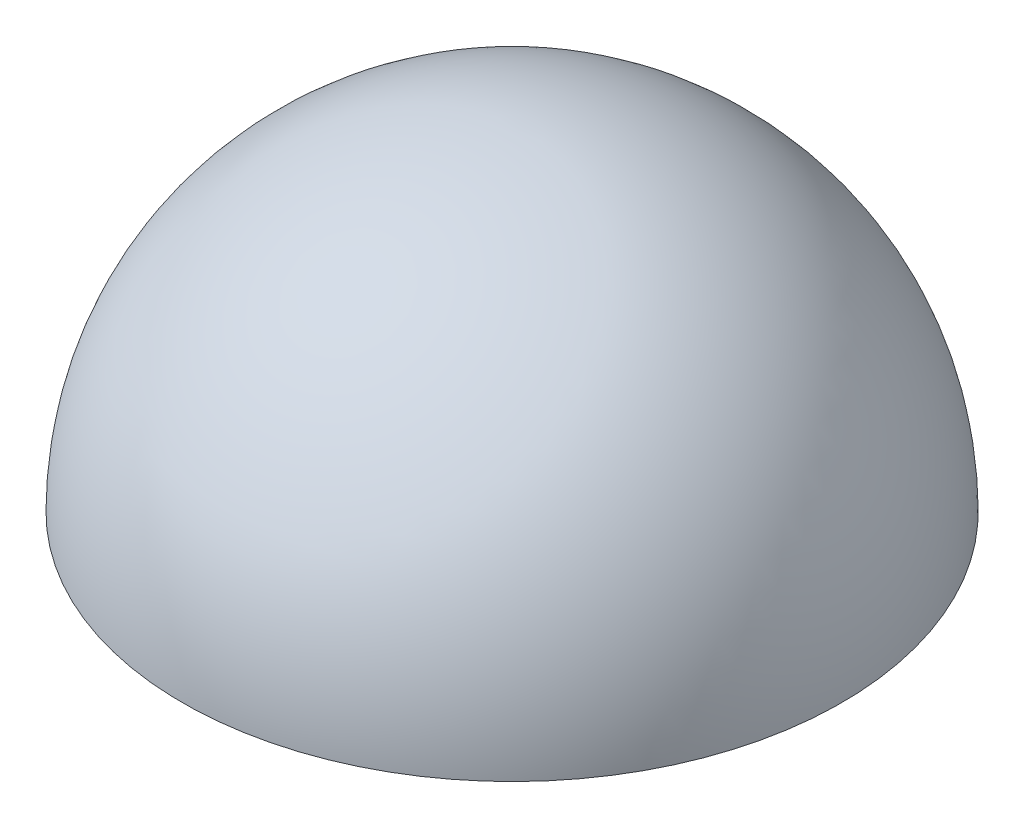
ISO-10303-21;
HEADER;
FILE_DESCRIPTION(('STEP AP214'),'2;1');
FILE_NAME('part.step','',(''),(''),'','','');
FILE_SCHEMA(('AUTOMOTIVE_DESIGN { 1 0 10303 214 1 1 1 1 }'));
ENDSEC;
DATA;
#1=APPLICATION_CONTEXT('core data for automotive mechanical design processes');
#2=APPLICATION_PROTOCOL_DEFINITION('international standard','automotive_design',2000,#1);
#3=PRODUCT_CONTEXT('',#1,'mechanical');
#4=PRODUCT('Part','Part','',(#3));
#5=PRODUCT_RELATED_PRODUCT_CATEGORY('part','',(#4));
#6=PRODUCT_DEFINITION_FORMATION('','',#4);
#7=PRODUCT_DEFINITION_CONTEXT('part definition',#1,'design');
#8=PRODUCT_DEFINITION('design','',#6,#7);
#9=PRODUCT_DEFINITION_SHAPE('','',#8);
#10=(LENGTH_UNIT() NAMED_UNIT(*) SI_UNIT(.MILLI.,.METRE.));
#11=(NAMED_UNIT(*) PLANE_ANGLE_UNIT() SI_UNIT($,.RADIAN.));
#12=(NAMED_UNIT(*) SI_UNIT($,.STERADIAN.) SOLID_ANGLE_UNIT());
#13=UNCERTAINTY_MEASURE_WITH_UNIT(LENGTH_MEASURE(1.E-05),#10,'distance_accuracy_value','');
#14=(GEOMETRIC_REPRESENTATION_CONTEXT(3) GLOBAL_UNCERTAINTY_ASSIGNED_CONTEXT((#13)) GLOBAL_UNIT_ASSIGNED_CONTEXT((#10,
#11,#12)) REPRESENTATION_CONTEXT('',''));
#15=CARTESIAN_POINT('',(0.,0.,0.));
#16=DIRECTION('',(0.,0.,1.));
#17=DIRECTION('',(1.,0.,0.));
#18=AXIS2_PLACEMENT_3D('',#15,#16,#17);
#19=CARTESIAN_POINT('',(0.,0.,0.));
#20=DIRECTION('',(-1.,0.,0.));
#21=DIRECTION('',(0.,0.,1.));
#22=AXIS2_PLACEMENT_3D('',#19,#20,#21);
#23=SPHERICAL_SURFACE('',#22,6.);
#24=CARTESIAN_POINT('',(0.,0.,0.));
#25=DIRECTION('',(0.,-1.,0.));
#26=DIRECTION('',(0.,0.,-1.));
#27=AXIS2_PLACEMENT_3D('',#24,#25,#26);
#28=SPHERICAL_SURFACE('',#27,6.);
#29=CARTESIAN_POINT('',(0.,0.,0.));
#30=DIRECTION('',(0.,-1.,0.));
#31=DIRECTION('',(0.,0.,-1.));
#32=AXIS2_PLACEMENT_3D('',#29,#30,#31);
#33=CIRCLE('',#32,6.);
#34=CARTESIAN_POINT('',(0.,0.,-6.));
#35=VERTEX_POINT('',#34);
#36=EDGE_CURVE('E37',#35,#35,#33,.T.);
#37=ORIENTED_EDGE('',*,*,#36,.F.);
#38=EDGE_LOOP('',(#37));
#39=FACE_BOUND('',#38,.T.);
#40=ADVANCED_FACE('F30',(#39),#28,.T.);
#41=CARTESIAN_POINT('',(0.,0.,0.));
#42=DIRECTION('',(-1.,0.,0.));
#43=DIRECTION('',(0.,0.,1.));
#44=AXIS2_PLACEMENT_3D('',#41,#42,#43);
#45=SPHERICAL_SURFACE('',#44,4.);
#46=CARTESIAN_POINT('',(0.,0.,0.));
#47=DIRECTION('',(0.,1.,0.));
#48=DIRECTION('',(0.,0.,-1.));
#49=AXIS2_PLACEMENT_3D('',#46,#47,#48);
#50=SPHERICAL_SURFACE('',#49,4.);
#51=CARTESIAN_POINT('',(0.,0.,0.));
#52=DIRECTION('',(0.,1.,0.));
#53=DIRECTION('',(0.,0.,-1.));
#54=AXIS2_PLACEMENT_3D('',#51,#52,#53);
#55=CIRCLE('',#54,4.);
#56=CARTESIAN_POINT('',(0.,0.,-4.));
#57=VERTEX_POINT('',#56);
#58=EDGE_CURVE('E10',#57,#57,#55,.T.);
#59=ORIENTED_EDGE('',*,*,#58,.F.);
#60=EDGE_LOOP('',(#59));
#61=FACE_BOUND('',#60,.T.);
#62=ADVANCED_FACE('F32',(#61),#50,.F.);
#63=CARTESIAN_POINT('',(0.,0.,0.));
#64=DIRECTION('',(0.,-1.,0.));
#65=DIRECTION('',(0.,0.,-1.));
#66=AXIS2_PLACEMENT_3D('',#63,#64,#65);
#67=PLANE('',#66);
#68=ORIENTED_EDGE('',*,*,#58,.T.);
#69=EDGE_LOOP('',(#68));
#70=FACE_BOUND('',#69,.T.);
#71=ORIENTED_EDGE('',*,*,#36,.T.);
#72=EDGE_LOOP('',(#71));
#73=FACE_BOUND('',#72,.T.);
#74=ADVANCED_FACE('F43',(#70,#73),#67,.T.);
#75=CLOSED_SHELL('',(#40,#62,#74));
#76=MANIFOLD_SOLID_BREP('B2',#75);
#77=ADVANCED_BREP_SHAPE_REPRESENTATION('',(#18,#76),#14);
#78=SHAPE_DEFINITION_REPRESENTATION(#9,#77);
ENDSEC;
END-ISO-10303-21;
